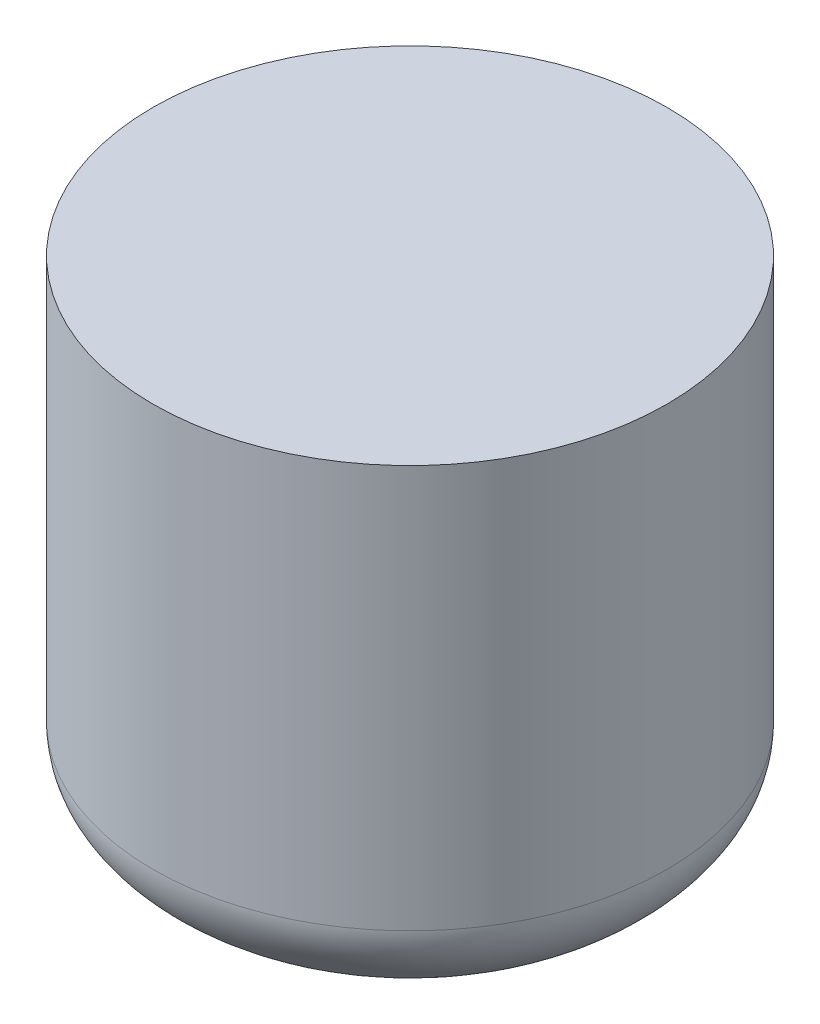
ISO-10303-21;
HEADER;
FILE_DESCRIPTION(('STEP AP214'),'2;1');
FILE_NAME('part.step','',(''),(''),'','','');
FILE_SCHEMA(('AUTOMOTIVE_DESIGN { 1 0 10303 214 1 1 1 1 }'));
ENDSEC;
DATA;
#1=APPLICATION_CONTEXT('core data for automotive mechanical design processes');
#2=APPLICATION_PROTOCOL_DEFINITION('international standard','automotive_design',2000,#1);
#3=PRODUCT_CONTEXT('',#1,'mechanical');
#4=PRODUCT('Part','Part','',(#3));
#5=PRODUCT_RELATED_PRODUCT_CATEGORY('part','',(#4));
#6=PRODUCT_DEFINITION_FORMATION('','',#4);
#7=PRODUCT_DEFINITION_CONTEXT('part definition',#1,'design');
#8=PRODUCT_DEFINITION('design','',#6,#7);
#9=PRODUCT_DEFINITION_SHAPE('','',#8);
#10=(LENGTH_UNIT() NAMED_UNIT(*) SI_UNIT(.MILLI.,.METRE.));
#11=(NAMED_UNIT(*) PLANE_ANGLE_UNIT() SI_UNIT($,.RADIAN.));
#12=(NAMED_UNIT(*) SI_UNIT($,.STERADIAN.) SOLID_ANGLE_UNIT());
#13=UNCERTAINTY_MEASURE_WITH_UNIT(LENGTH_MEASURE(1.E-05),#10,'distance_accuracy_value','');
#14=(GEOMETRIC_REPRESENTATION_CONTEXT(3) GLOBAL_UNCERTAINTY_ASSIGNED_CONTEXT((#13)) GLOBAL_UNIT_ASSIGNED_CONTEXT((#10,
#11,#12)) REPRESENTATION_CONTEXT('',''));
#15=CARTESIAN_POINT('',(0.,0.,0.));
#16=DIRECTION('',(0.,0.,1.));
#17=DIRECTION('',(1.,0.,0.));
#18=AXIS2_PLACEMENT_3D('',#15,#16,#17);
#19=CARTESIAN_POINT('',(0.,0.,0.));
#20=DIRECTION('',(0.,0.,1.));
#21=DIRECTION('',(-1.,0.,0.));
#22=AXIS2_PLACEMENT_3D('',#19,#20,#21);
#23=ELLIPSE('',#22,69.85,34.925);
#24=TRIMMED_CURVE('',#23,(PARAMETER_VALUE(1.5707963267949)),(PARAMETER_VALUE(4.71238898038469)),
.T.,.PARAMETER.);
#25=CARTESIAN_POINT('',(0.,-34.925,0.));
#26=DIRECTION('',(0.,-1.,0.));
#27=AXIS1_PLACEMENT('',#25,#26);
#28=SURFACE_OF_REVOLUTION('',#24,#27);
#29=CARTESIAN_POINT('',(0.,0.,0.));
#30=DIRECTION('',(0.,-1.,0.));
#31=DIRECTION('',(1.,0.,0.));
#32=AXIS2_PLACEMENT_3D('',#29,#30,#31);
#33=CIRCLE('',#32,69.85);
#34=CARTESIAN_POINT('',(69.85,0.,0.));
#35=VERTEX_POINT('',#34);
#36=EDGE_CURVE('E11',#35,#35,#33,.T.);
#37=ORIENTED_EDGE('',*,*,#36,.T.);
#38=EDGE_LOOP('',(#37));
#39=FACE_BOUND('',#38,.T.);
#40=CARTESIAN_POINT('',(0.,-34.925,0.));
#41=VERTEX_POINT('',#40);
#42=VERTEX_LOOP('',#41);
#43=FACE_BOUND('',#42,.T.);
#44=ADVANCED_FACE('F41',(#39,#43),#28,.F.);
#45=CARTESIAN_POINT('',(0.,-34.925,0.));
#46=DIRECTION('',(0.,-1.,0.));
#47=DIRECTION('',(1.,0.,0.));
#48=AXIS2_PLACEMENT_3D('',#45,#46,#47);
#49=CYLINDRICAL_SURFACE('',#48,69.85);
#50=CARTESIAN_POINT('',(0.,109.4994,0.));
#51=DIRECTION('',(0.,-1.,0.));
#52=DIRECTION('',(1.,0.,0.));
#53=AXIS2_PLACEMENT_3D('',#50,#51,#52);
#54=CIRCLE('',#53,69.85);
#55=CARTESIAN_POINT('',(69.85,109.4994,0.));
#56=VERTEX_POINT('',#55);
#57=EDGE_CURVE('E49',#56,#56,#54,.T.);
#58=ORIENTED_EDGE('',*,*,#57,.T.);
#59=EDGE_LOOP('',(#58));
#60=FACE_BOUND('',#59,.T.);
#61=ORIENTED_EDGE('',*,*,#36,.F.);
#62=EDGE_LOOP('',(#61));
#63=FACE_BOUND('',#62,.T.);
#64=ADVANCED_FACE('F53',(#60,#63),#49,.T.);
#65=CARTESIAN_POINT('',(0.,109.4994,0.));
#66=DIRECTION('',(0.,1.,0.));
#67=DIRECTION('',(-1.,0.,0.));
#68=AXIS2_PLACEMENT_3D('',#65,#66,#67);
#69=PLANE('',#68);
#70=ORIENTED_EDGE('',*,*,#57,.F.);
#71=EDGE_LOOP('',(#70));
#72=FACE_BOUND('',#71,.T.);
#73=ADVANCED_FACE('F58',(#72),#69,.T.);
#74=CLOSED_SHELL('',(#44,#64,#73));
#75=MANIFOLD_SOLID_BREP('B2',#74);
#76=ADVANCED_BREP_SHAPE_REPRESENTATION('',(#18,#75),#14);
#77=SHAPE_DEFINITION_REPRESENTATION(#9,#76);
ENDSEC;
END-ISO-10303-21;
